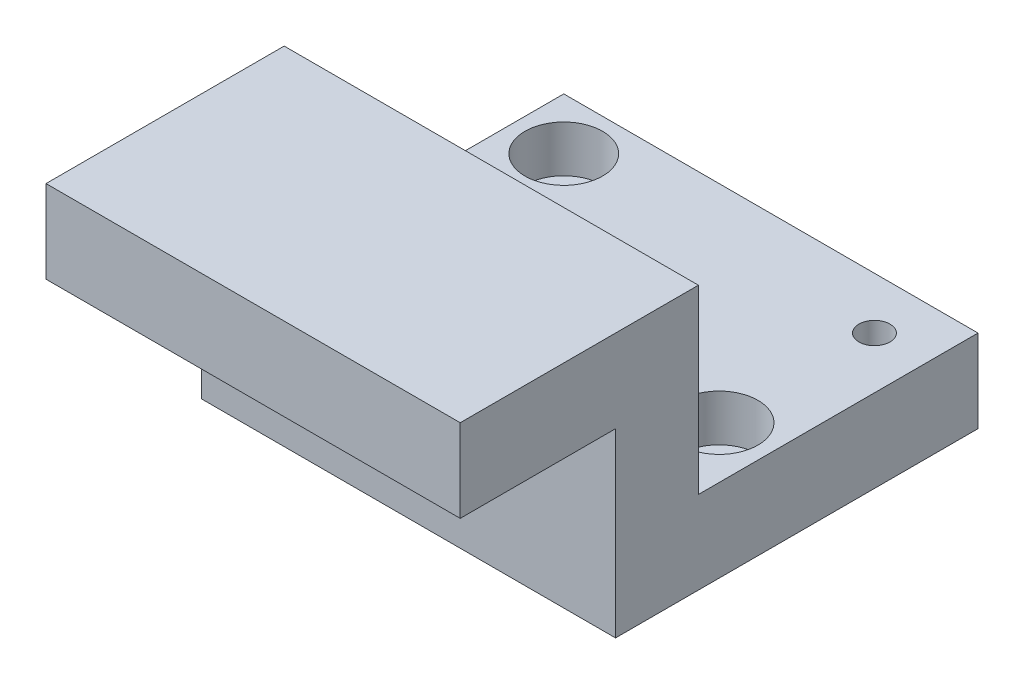
ISO-10303-21;
HEADER;
FILE_DESCRIPTION(('STEP AP214'),'2;1');
FILE_NAME('part.step','',(''),(''),'','','');
FILE_SCHEMA(('AUTOMOTIVE_DESIGN { 1 0 10303 214 1 1 1 1 }'));
ENDSEC;
DATA;
#1=APPLICATION_CONTEXT('core data for automotive mechanical design processes');
#2=APPLICATION_PROTOCOL_DEFINITION('international standard','automotive_design',2000,#1);
#3=PRODUCT_CONTEXT('',#1,'mechanical');
#4=PRODUCT('Part','Part','',(#3));
#5=PRODUCT_RELATED_PRODUCT_CATEGORY('part','',(#4));
#6=PRODUCT_DEFINITION_FORMATION('','',#4);
#7=PRODUCT_DEFINITION_CONTEXT('part definition',#1,'design');
#8=PRODUCT_DEFINITION('design','',#6,#7);
#9=PRODUCT_DEFINITION_SHAPE('','',#8);
#10=(LENGTH_UNIT() NAMED_UNIT(*) SI_UNIT(.MILLI.,.METRE.));
#11=(NAMED_UNIT(*) PLANE_ANGLE_UNIT() SI_UNIT($,.RADIAN.));
#12=(NAMED_UNIT(*) SI_UNIT($,.STERADIAN.) SOLID_ANGLE_UNIT());
#13=UNCERTAINTY_MEASURE_WITH_UNIT(LENGTH_MEASURE(1.E-05),#10,'distance_accuracy_value','');
#14=(GEOMETRIC_REPRESENTATION_CONTEXT(3) GLOBAL_UNCERTAINTY_ASSIGNED_CONTEXT((#13)) GLOBAL_UNIT_ASSIGNED_CONTEXT((#10,
#11,#12)) REPRESENTATION_CONTEXT('',''));
#15=CARTESIAN_POINT('',(0.,0.,0.));
#16=DIRECTION('',(0.,0.,1.));
#17=DIRECTION('',(1.,0.,0.));
#18=AXIS2_PLACEMENT_3D('',#15,#16,#17);
#19=CARTESIAN_POINT('',(-40.,-25.5,100.));
#20=DIRECTION('',(1.,0.,0.));
#21=DIRECTION('',(0.,0.,-1.));
#22=AXIS2_PLACEMENT_3D('',#19,#20,#21);
#23=PLANE('',#22);
#24=DIRECTION('',(0.,-1.,0.));
#25=VECTOR('',#24,1.);
#26=CARTESIAN_POINT('',(-40.,25.5,54.));
#27=LINE('',#26,#25);
#28=CARTESIAN_POINT('',(-40.,25.5,54.));
#29=VERTEX_POINT('',#28);
#30=CARTESIAN_POINT('',(-40.,-9.5,54.));
#31=VERTEX_POINT('',#30);
#32=EDGE_CURVE('E98',#29,#31,#27,.T.);
#33=ORIENTED_EDGE('',*,*,#32,.T.);
#34=DIRECTION('',(0.,0.,-1.));
#35=VECTOR('',#34,1.);
#36=CARTESIAN_POINT('',(-40.,-9.49999999999999,0.));
#37=LINE('',#36,#35);
#38=CARTESIAN_POINT('',(-40.,-9.49999999999999,0.));
#39=VERTEX_POINT('',#38);
#40=EDGE_CURVE('E109',#31,#39,#37,.T.);
#41=ORIENTED_EDGE('',*,*,#40,.T.);
#42=DIRECTION('',(0.,-1.,0.));
#43=VECTOR('',#42,1.);
#44=CARTESIAN_POINT('',(-40.,-25.5,0.));
#45=LINE('',#44,#43);
#46=CARTESIAN_POINT('',(-40.,-25.5,0.));
#47=VERTEX_POINT('',#46);
#48=EDGE_CURVE('E149',#39,#47,#45,.T.);
#49=ORIENTED_EDGE('',*,*,#48,.T.);
#50=DIRECTION('',(0.,0.,-1.));
#51=VECTOR('',#50,1.);
#52=CARTESIAN_POINT('',(-40.,-25.5,100.));
#53=LINE('',#52,#51);
#54=CARTESIAN_POINT('',(-40.,-25.5,70.));
#55=VERTEX_POINT('',#54);
#56=EDGE_CURVE('E11',#55,#47,#53,.T.);
#57=ORIENTED_EDGE('',*,*,#56,.F.);
#58=DIRECTION('',(0.,1.,0.));
#59=VECTOR('',#58,1.);
#60=CARTESIAN_POINT('',(-40.,-25.5,70.));
#61=LINE('',#60,#59);
#62=CARTESIAN_POINT('',(-40.,9.50000000000001,70.));
#63=VERTEX_POINT('',#62);
#64=EDGE_CURVE('E165',#55,#63,#61,.T.);
#65=ORIENTED_EDGE('',*,*,#64,.T.);
#66=DIRECTION('',(0.,0.,1.));
#67=VECTOR('',#66,1.);
#68=CARTESIAN_POINT('',(-40.,9.50000000000001,100.));
#69=LINE('',#68,#67);
#70=CARTESIAN_POINT('',(-40.,9.50000000000001,100.));
#71=VERTEX_POINT('',#70);
#72=EDGE_CURVE('E167',#63,#71,#69,.T.);
#73=ORIENTED_EDGE('',*,*,#72,.T.);
#74=DIRECTION('',(0.,-1.,0.));
#75=VECTOR('',#74,1.);
#76=CARTESIAN_POINT('',(-40.,-25.5,100.));
#77=LINE('',#76,#75);
#78=CARTESIAN_POINT('',(-40.,25.5,100.));
#79=VERTEX_POINT('',#78);
#80=EDGE_CURVE('E123',#79,#71,#77,.T.);
#81=ORIENTED_EDGE('',*,*,#80,.F.);
#82=DIRECTION('',(0.,0.,-1.));
#83=VECTOR('',#82,1.);
#84=CARTESIAN_POINT('',(-40.,25.5,100.));
#85=LINE('',#84,#83);
#86=EDGE_CURVE('E116',#79,#29,#85,.T.);
#87=ORIENTED_EDGE('',*,*,#86,.T.);
#88=EDGE_LOOP('',(#33,#41,#49,#57,#65,#73,#81,#87));
#89=FACE_BOUND('',#88,.T.);
#90=ADVANCED_FACE('F35',(#89),#23,.F.);
#91=CARTESIAN_POINT('',(40.,-25.5,100.));
#92=DIRECTION('',(0.,1.,0.));
#93=DIRECTION('',(-1.,0.,0.));
#94=AXIS2_PLACEMENT_3D('',#91,#92,#93);
#95=PLANE('',#94);
#96=CARTESIAN_POINT('',(-30.,-25.5,40.));
#97=DIRECTION('',(0.,1.,0.));
#98=DIRECTION('',(0.,0.,1.));
#99=AXIS2_PLACEMENT_3D('',#96,#97,#98);
#100=CIRCLE('',#99,3.);
#101=CARTESIAN_POINT('',(-30.,-25.5,43.));
#102=VERTEX_POINT('',#101);
#103=EDGE_CURVE('E207',#102,#102,#100,.T.);
#104=ORIENTED_EDGE('',*,*,#103,.T.);
#105=EDGE_LOOP('',(#104));
#106=FACE_BOUND('',#105,.T.);
#107=CARTESIAN_POINT('',(30.,-25.5,9.99999999999999));
#108=DIRECTION('',(0.,1.,0.));
#109=DIRECTION('',(0.,0.,1.));
#110=AXIS2_PLACEMENT_3D('',#107,#108,#109);
#111=CIRCLE('',#110,3.);
#112=CARTESIAN_POINT('',(30.,-25.5,13.));
#113=VERTEX_POINT('',#112);
#114=EDGE_CURVE('E201',#113,#113,#111,.T.);
#115=ORIENTED_EDGE('',*,*,#114,.T.);
#116=EDGE_LOOP('',(#115));
#117=FACE_BOUND('',#116,.T.);
#118=CARTESIAN_POINT('',(-30.,-25.5,9.99999999999999));
#119=DIRECTION('',(0.,1.,0.));
#120=DIRECTION('',(0.,0.,1.));
#121=AXIS2_PLACEMENT_3D('',#118,#119,#120);
#122=CIRCLE('',#121,4.5);
#123=CARTESIAN_POINT('',(-30.,-25.5,14.5));
#124=VERTEX_POINT('',#123);
#125=EDGE_CURVE('E189',#124,#124,#122,.T.);
#126=ORIENTED_EDGE('',*,*,#125,.T.);
#127=EDGE_LOOP('',(#126));
#128=FACE_BOUND('',#127,.T.);
#129=CARTESIAN_POINT('',(30.,-25.5,40.));
#130=DIRECTION('',(0.,1.,0.));
#131=DIRECTION('',(0.,0.,1.));
#132=AXIS2_PLACEMENT_3D('',#129,#130,#131);
#133=CIRCLE('',#132,4.5);
#134=CARTESIAN_POINT('',(30.,-25.5,44.5));
#135=VERTEX_POINT('',#134);
#136=EDGE_CURVE('E176',#135,#135,#133,.T.);
#137=ORIENTED_EDGE('',*,*,#136,.T.);
#138=EDGE_LOOP('',(#137));
#139=FACE_BOUND('',#138,.T.);
#140=DIRECTION('',(0.,0.,-1.));
#141=VECTOR('',#140,1.);
#142=CARTESIAN_POINT('',(40.,-25.5,100.));
#143=LINE('',#142,#141);
#144=CARTESIAN_POINT('',(40.,-25.5,70.));
#145=VERTEX_POINT('',#144);
#146=CARTESIAN_POINT('',(40.,-25.5,0.));
#147=VERTEX_POINT('',#146);
#148=EDGE_CURVE('E42',#145,#147,#143,.T.);
#149=ORIENTED_EDGE('',*,*,#148,.F.);
#150=DIRECTION('',(1.,0.,0.));
#151=VECTOR('',#150,1.);
#152=CARTESIAN_POINT('',(-40.,-25.5,70.));
#153=LINE('',#152,#151);
#154=EDGE_CURVE('E156',#55,#145,#153,.T.);
#155=ORIENTED_EDGE('',*,*,#154,.F.);
#156=ORIENTED_EDGE('',*,*,#56,.T.);
#157=DIRECTION('',(1.,0.,0.));
#158=VECTOR('',#157,1.);
#159=CARTESIAN_POINT('',(40.,-25.5,0.));
#160=LINE('',#159,#158);
#161=EDGE_CURVE('E144',#47,#147,#160,.T.);
#162=ORIENTED_EDGE('',*,*,#161,.T.);
#163=EDGE_LOOP('',(#149,#155,#156,#162));
#164=FACE_BOUND('',#163,.T.);
#165=ADVANCED_FACE('F145',(#106,#117,#128,#139,#164),#95,.F.);
#166=CARTESIAN_POINT('',(40.,-25.5,100.));
#167=DIRECTION('',(-1.,0.,0.));
#168=DIRECTION('',(0.,0.,1.));
#169=AXIS2_PLACEMENT_3D('',#166,#167,#168);
#170=PLANE('',#169);
#171=DIRECTION('',(0.,1.,0.));
#172=VECTOR('',#171,1.);
#173=CARTESIAN_POINT('',(40.,-25.5,0.));
#174=LINE('',#173,#172);
#175=CARTESIAN_POINT('',(40.,-9.5,0.));
#176=VERTEX_POINT('',#175);
#177=EDGE_CURVE('E130',#147,#176,#174,.T.);
#178=ORIENTED_EDGE('',*,*,#177,.T.);
#179=DIRECTION('',(0.,0.,-1.));
#180=VECTOR('',#179,1.);
#181=CARTESIAN_POINT('',(40.,-9.49999999999999,0.));
#182=LINE('',#181,#180);
#183=CARTESIAN_POINT('',(40.,-9.5,54.));
#184=VERTEX_POINT('',#183);
#185=EDGE_CURVE('E49',#184,#176,#182,.T.);
#186=ORIENTED_EDGE('',*,*,#185,.F.);
#187=DIRECTION('',(0.,-1.,0.));
#188=VECTOR('',#187,1.);
#189=CARTESIAN_POINT('',(40.,25.5,54.));
#190=LINE('',#189,#188);
#191=CARTESIAN_POINT('',(40.,25.5,54.));
#192=VERTEX_POINT('',#191);
#193=EDGE_CURVE('E174',#192,#184,#190,.T.);
#194=ORIENTED_EDGE('',*,*,#193,.F.);
#195=DIRECTION('',(0.,0.,-1.));
#196=VECTOR('',#195,1.);
#197=CARTESIAN_POINT('',(40.,25.5,100.));
#198=LINE('',#197,#196);
#199=CARTESIAN_POINT('',(40.,25.5,100.));
#200=VERTEX_POINT('',#199);
#201=EDGE_CURVE('E119',#200,#192,#198,.T.);
#202=ORIENTED_EDGE('',*,*,#201,.F.);
#203=DIRECTION('',(0.,1.,0.));
#204=VECTOR('',#203,1.);
#205=CARTESIAN_POINT('',(40.,-25.5,100.));
#206=LINE('',#205,#204);
#207=CARTESIAN_POINT('',(40.,9.50000000000001,100.));
#208=VERTEX_POINT('',#207);
#209=EDGE_CURVE('E127',#208,#200,#206,.T.);
#210=ORIENTED_EDGE('',*,*,#209,.F.);
#211=DIRECTION('',(0.,0.,1.));
#212=VECTOR('',#211,1.);
#213=CARTESIAN_POINT('',(40.,9.50000000000001,100.));
#214=LINE('',#213,#212);
#215=CARTESIAN_POINT('',(40.,9.50000000000001,70.));
#216=VERTEX_POINT('',#215);
#217=EDGE_CURVE('E57',#216,#208,#214,.T.);
#218=ORIENTED_EDGE('',*,*,#217,.F.);
#219=DIRECTION('',(0.,1.,0.));
#220=VECTOR('',#219,1.);
#221=CARTESIAN_POINT('',(40.,-25.5,70.));
#222=LINE('',#221,#220);
#223=EDGE_CURVE('E140',#145,#216,#222,.T.);
#224=ORIENTED_EDGE('',*,*,#223,.F.);
#225=ORIENTED_EDGE('',*,*,#148,.T.);
#226=EDGE_LOOP('',(#178,#186,#194,#202,#210,#218,#224,#225));
#227=FACE_BOUND('',#226,.T.);
#228=ADVANCED_FACE('F137',(#227),#170,.F.);
#229=CARTESIAN_POINT('',(40.,25.5,100.));
#230=DIRECTION('',(0.,-1.,0.));
#231=DIRECTION('',(1.,0.,0.));
#232=AXIS2_PLACEMENT_3D('',#229,#230,#231);
#233=PLANE('',#232);
#234=ORIENTED_EDGE('',*,*,#201,.T.);
#235=DIRECTION('',(1.,0.,0.));
#236=VECTOR('',#235,1.);
#237=CARTESIAN_POINT('',(-40.,25.5,54.));
#238=LINE('',#237,#236);
#239=EDGE_CURVE('E102',#29,#192,#238,.T.);
#240=ORIENTED_EDGE('',*,*,#239,.F.);
#241=ORIENTED_EDGE('',*,*,#86,.F.);
#242=DIRECTION('',(-1.,0.,0.));
#243=VECTOR('',#242,1.);
#244=CARTESIAN_POINT('',(40.,25.5,100.));
#245=LINE('',#244,#243);
#246=EDGE_CURVE('E124',#200,#79,#245,.T.);
#247=ORIENTED_EDGE('',*,*,#246,.F.);
#248=EDGE_LOOP('',(#234,#240,#241,#247));
#249=FACE_BOUND('',#248,.T.);
#250=ADVANCED_FACE('F114',(#249),#233,.F.);
#251=CARTESIAN_POINT('',(0.,0.,100.));
#252=DIRECTION('',(0.,0.,1.));
#253=DIRECTION('',(1.,0.,0.));
#254=AXIS2_PLACEMENT_3D('',#251,#252,#253);
#255=PLANE('',#254);
#256=DIRECTION('',(1.,0.,0.));
#257=VECTOR('',#256,1.);
#258=CARTESIAN_POINT('',(-40.,9.50000000000001,100.));
#259=LINE('',#258,#257);
#260=EDGE_CURVE('E159',#71,#208,#259,.T.);
#261=ORIENTED_EDGE('',*,*,#260,.T.);
#262=ORIENTED_EDGE('',*,*,#209,.T.);
#263=ORIENTED_EDGE('',*,*,#246,.T.);
#264=ORIENTED_EDGE('',*,*,#80,.T.);
#265=EDGE_LOOP('',(#261,#262,#263,#264));
#266=FACE_BOUND('',#265,.T.);
#267=ADVANCED_FACE('F257',(#266),#255,.T.);
#268=CARTESIAN_POINT('',(0.,0.,0.));
#269=DIRECTION('',(0.,0.,1.));
#270=DIRECTION('',(1.,0.,0.));
#271=AXIS2_PLACEMENT_3D('',#268,#269,#270);
#272=PLANE('',#271);
#273=ORIENTED_EDGE('',*,*,#48,.F.);
#274=DIRECTION('',(1.,0.,0.));
#275=VECTOR('',#274,1.);
#276=CARTESIAN_POINT('',(-40.,-9.49999999999999,0.));
#277=LINE('',#276,#275);
#278=EDGE_CURVE('E151',#39,#176,#277,.T.);
#279=ORIENTED_EDGE('',*,*,#278,.T.);
#280=ORIENTED_EDGE('',*,*,#177,.F.);
#281=ORIENTED_EDGE('',*,*,#161,.F.);
#282=EDGE_LOOP('',(#273,#279,#280,#281));
#283=FACE_BOUND('',#282,.T.);
#284=ADVANCED_FACE('F150',(#283),#272,.F.);
#285=CARTESIAN_POINT('',(-40.,9.50000000000001,100.));
#286=DIRECTION('',(0.,1.,0.));
#287=DIRECTION('',(0.,0.,1.));
#288=AXIS2_PLACEMENT_3D('',#285,#286,#287);
#289=PLANE('',#288);
#290=ORIENTED_EDGE('',*,*,#217,.T.);
#291=ORIENTED_EDGE('',*,*,#260,.F.);
#292=ORIENTED_EDGE('',*,*,#72,.F.);
#293=DIRECTION('',(1.,0.,0.));
#294=VECTOR('',#293,1.);
#295=CARTESIAN_POINT('',(-40.,9.50000000000001,70.));
#296=LINE('',#295,#294);
#297=EDGE_CURVE('E160',#63,#216,#296,.T.);
#298=ORIENTED_EDGE('',*,*,#297,.T.);
#299=EDGE_LOOP('',(#290,#291,#292,#298));
#300=FACE_BOUND('',#299,.T.);
#301=ADVANCED_FACE('F260',(#300),#289,.F.);
#302=CARTESIAN_POINT('',(-40.,-25.5,70.));
#303=DIRECTION('',(0.,0.,-1.));
#304=DIRECTION('',(-1.,0.,0.));
#305=AXIS2_PLACEMENT_3D('',#302,#303,#304);
#306=PLANE('',#305);
#307=ORIENTED_EDGE('',*,*,#223,.T.);
#308=ORIENTED_EDGE('',*,*,#297,.F.);
#309=ORIENTED_EDGE('',*,*,#64,.F.);
#310=ORIENTED_EDGE('',*,*,#154,.T.);
#311=EDGE_LOOP('',(#307,#308,#309,#310));
#312=FACE_BOUND('',#311,.T.);
#313=ADVANCED_FACE('F219',(#312),#306,.F.);
#314=CARTESIAN_POINT('',(-40.,-9.49999999999999,0.));
#315=DIRECTION('',(0.,-1.,0.));
#316=DIRECTION('',(0.,0.,-1.));
#317=AXIS2_PLACEMENT_3D('',#314,#315,#316);
#318=PLANE('',#317);
#319=CARTESIAN_POINT('',(-30.,-9.5,40.));
#320=DIRECTION('',(0.,1.,0.));
#321=DIRECTION('',(0.,0.,1.));
#322=AXIS2_PLACEMENT_3D('',#319,#320,#321);
#323=CIRCLE('',#322,3.);
#324=CARTESIAN_POINT('',(-30.,-9.5,43.));
#325=VERTEX_POINT('',#324);
#326=EDGE_CURVE('E210',#325,#325,#323,.T.);
#327=ORIENTED_EDGE('',*,*,#326,.F.);
#328=EDGE_LOOP('',(#327));
#329=FACE_BOUND('',#328,.T.);
#330=CARTESIAN_POINT('',(30.,-9.49999999999999,9.99999999999999));
#331=DIRECTION('',(0.,1.,0.));
#332=DIRECTION('',(0.,0.,1.));
#333=AXIS2_PLACEMENT_3D('',#330,#331,#332);
#334=CIRCLE('',#333,3.);
#335=CARTESIAN_POINT('',(30.,-9.49999999999999,13.));
#336=VERTEX_POINT('',#335);
#337=EDGE_CURVE('E204',#336,#336,#334,.T.);
#338=ORIENTED_EDGE('',*,*,#337,.F.);
#339=EDGE_LOOP('',(#338));
#340=FACE_BOUND('',#339,.T.);
#341=CARTESIAN_POINT('',(-30.,-9.49999999999999,9.99999999999999));
#342=DIRECTION('',(0.,1.,0.));
#343=DIRECTION('',(0.,0.,1.));
#344=AXIS2_PLACEMENT_3D('',#341,#342,#343);
#345=CIRCLE('',#344,7.5);
#346=CARTESIAN_POINT('',(-30.,-9.49999999999999,17.5));
#347=VERTEX_POINT('',#346);
#348=EDGE_CURVE('E198',#347,#347,#345,.T.);
#349=ORIENTED_EDGE('',*,*,#348,.F.);
#350=EDGE_LOOP('',(#349));
#351=FACE_BOUND('',#350,.T.);
#352=CARTESIAN_POINT('',(30.,-9.5,40.));
#353=DIRECTION('',(0.,1.,0.));
#354=DIRECTION('',(0.,0.,1.));
#355=AXIS2_PLACEMENT_3D('',#352,#353,#354);
#356=CIRCLE('',#355,7.5);
#357=CARTESIAN_POINT('',(30.,-9.5,47.5));
#358=VERTEX_POINT('',#357);
#359=EDGE_CURVE('E186',#358,#358,#356,.T.);
#360=ORIENTED_EDGE('',*,*,#359,.F.);
#361=EDGE_LOOP('',(#360));
#362=FACE_BOUND('',#361,.T.);
#363=ORIENTED_EDGE('',*,*,#185,.T.);
#364=ORIENTED_EDGE('',*,*,#278,.F.);
#365=ORIENTED_EDGE('',*,*,#40,.F.);
#366=DIRECTION('',(1.,0.,0.));
#367=VECTOR('',#366,1.);
#368=CARTESIAN_POINT('',(-40.,-9.5,54.));
#369=LINE('',#368,#367);
#370=EDGE_CURVE('E104',#31,#184,#369,.T.);
#371=ORIENTED_EDGE('',*,*,#370,.T.);
#372=EDGE_LOOP('',(#363,#364,#365,#371));
#373=FACE_BOUND('',#372,.T.);
#374=ADVANCED_FACE('F216',(#329,#340,#351,#362,#373),#318,.F.);
#375=CARTESIAN_POINT('',(-40.,25.5,54.));
#376=DIRECTION('',(0.,0.,1.));
#377=DIRECTION('',(0.,-1.,0.));
#378=AXIS2_PLACEMENT_3D('',#375,#376,#377);
#379=PLANE('',#378);
#380=ORIENTED_EDGE('',*,*,#193,.T.);
#381=ORIENTED_EDGE('',*,*,#370,.F.);
#382=ORIENTED_EDGE('',*,*,#32,.F.);
#383=ORIENTED_EDGE('',*,*,#239,.T.);
#384=EDGE_LOOP('',(#380,#381,#382,#383));
#385=FACE_BOUND('',#384,.T.);
#386=ADVANCED_FACE('F101',(#385),#379,.F.);
#387=CARTESIAN_POINT('',(30.,-9.5,40.));
#388=DIRECTION('',(0.,1.,0.));
#389=DIRECTION('',(0.,0.,1.));
#390=AXIS2_PLACEMENT_3D('',#387,#388,#389);
#391=CYLINDRICAL_SURFACE('',#390,4.5);
#392=ORIENTED_EDGE('',*,*,#136,.F.);
#393=EDGE_LOOP('',(#392));
#394=FACE_BOUND('',#393,.T.);
#395=CARTESIAN_POINT('',(30.,-18.5,40.));
#396=DIRECTION('',(0.,1.,0.));
#397=DIRECTION('',(0.,0.,1.));
#398=AXIS2_PLACEMENT_3D('',#395,#396,#397);
#399=CIRCLE('',#398,4.5);
#400=CARTESIAN_POINT('',(30.,-18.5,44.5));
#401=VERTEX_POINT('',#400);
#402=EDGE_CURVE('E180',#401,#401,#399,.T.);
#403=ORIENTED_EDGE('',*,*,#402,.T.);
#404=EDGE_LOOP('',(#403));
#405=FACE_BOUND('',#404,.T.);
#406=ADVANCED_FACE('F240',(#394,#405),#391,.F.);
#407=CARTESIAN_POINT('',(34.5,-18.5,40.));
#408=DIRECTION('',(0.,-1.,0.));
#409=DIRECTION('',(0.,0.,-1.));
#410=AXIS2_PLACEMENT_3D('',#407,#408,#409);
#411=PLANE('',#410);
#412=ORIENTED_EDGE('',*,*,#402,.F.);
#413=EDGE_LOOP('',(#412));
#414=FACE_BOUND('',#413,.T.);
#415=CARTESIAN_POINT('',(30.,-18.5,40.));
#416=DIRECTION('',(0.,1.,0.));
#417=DIRECTION('',(0.,0.,1.));
#418=AXIS2_PLACEMENT_3D('',#415,#416,#417);
#419=CIRCLE('',#418,7.5);
#420=CARTESIAN_POINT('',(30.,-18.5,47.5));
#421=VERTEX_POINT('',#420);
#422=EDGE_CURVE('E183',#421,#421,#419,.T.);
#423=ORIENTED_EDGE('',*,*,#422,.T.);
#424=EDGE_LOOP('',(#423));
#425=FACE_BOUND('',#424,.T.);
#426=ADVANCED_FACE('F230',(#414,#425),#411,.F.);
#427=CARTESIAN_POINT('',(30.,-9.5,40.));
#428=DIRECTION('',(0.,1.,0.));
#429=DIRECTION('',(0.,0.,1.));
#430=AXIS2_PLACEMENT_3D('',#427,#428,#429);
#431=CYLINDRICAL_SURFACE('',#430,7.5);
#432=ORIENTED_EDGE('',*,*,#422,.F.);
#433=EDGE_LOOP('',(#432));
#434=FACE_BOUND('',#433,.T.);
#435=ORIENTED_EDGE('',*,*,#359,.T.);
#436=EDGE_LOOP('',(#435));
#437=FACE_BOUND('',#436,.T.);
#438=ADVANCED_FACE('F227',(#434,#437),#431,.F.);
#439=CARTESIAN_POINT('',(-30.,-9.49999999999999,9.99999999999999));
#440=DIRECTION('',(0.,1.,0.));
#441=DIRECTION('',(0.,0.,1.));
#442=AXIS2_PLACEMENT_3D('',#439,#440,#441);
#443=CYLINDRICAL_SURFACE('',#442,4.5);
#444=ORIENTED_EDGE('',*,*,#125,.F.);
#445=EDGE_LOOP('',(#444));
#446=FACE_BOUND('',#445,.T.);
#447=CARTESIAN_POINT('',(-30.,-18.5,9.99999999999999));
#448=DIRECTION('',(0.,1.,0.));
#449=DIRECTION('',(0.,0.,1.));
#450=AXIS2_PLACEMENT_3D('',#447,#448,#449);
#451=CIRCLE('',#450,4.5);
#452=CARTESIAN_POINT('',(-30.,-18.5,14.5));
#453=VERTEX_POINT('',#452);
#454=EDGE_CURVE('E192',#453,#453,#451,.T.);
#455=ORIENTED_EDGE('',*,*,#454,.T.);
#456=EDGE_LOOP('',(#455));
#457=FACE_BOUND('',#456,.T.);
#458=ADVANCED_FACE('F229',(#446,#457),#443,.F.);
#459=CARTESIAN_POINT('',(-25.5,-18.5,9.99999999999999));
#460=DIRECTION('',(0.,-1.,0.));
#461=DIRECTION('',(0.,0.,-1.));
#462=AXIS2_PLACEMENT_3D('',#459,#460,#461);
#463=PLANE('',#462);
#464=ORIENTED_EDGE('',*,*,#454,.F.);
#465=EDGE_LOOP('',(#464));
#466=FACE_BOUND('',#465,.T.);
#467=CARTESIAN_POINT('',(-30.,-18.5,9.99999999999999));
#468=DIRECTION('',(0.,1.,0.));
#469=DIRECTION('',(0.,0.,1.));
#470=AXIS2_PLACEMENT_3D('',#467,#468,#469);
#471=CIRCLE('',#470,7.5);
#472=CARTESIAN_POINT('',(-30.,-18.5,17.5));
#473=VERTEX_POINT('',#472);
#474=EDGE_CURVE('E195',#473,#473,#471,.T.);
#475=ORIENTED_EDGE('',*,*,#474,.T.);
#476=EDGE_LOOP('',(#475));
#477=FACE_BOUND('',#476,.T.);
#478=ADVANCED_FACE('F237',(#466,#477),#463,.F.);
#479=CARTESIAN_POINT('',(-30.,-9.49999999999999,9.99999999999999));
#480=DIRECTION('',(0.,1.,0.));
#481=DIRECTION('',(0.,0.,1.));
#482=AXIS2_PLACEMENT_3D('',#479,#480,#481);
#483=CYLINDRICAL_SURFACE('',#482,7.5);
#484=ORIENTED_EDGE('',*,*,#474,.F.);
#485=EDGE_LOOP('',(#484));
#486=FACE_BOUND('',#485,.T.);
#487=ORIENTED_EDGE('',*,*,#348,.T.);
#488=EDGE_LOOP('',(#487));
#489=FACE_BOUND('',#488,.T.);
#490=ADVANCED_FACE('F304',(#486,#489),#483,.F.);
#491=CARTESIAN_POINT('',(30.,-9.49999999999999,9.99999999999999));
#492=DIRECTION('',(0.,1.,0.));
#493=DIRECTION('',(0.,0.,1.));
#494=AXIS2_PLACEMENT_3D('',#491,#492,#493);
#495=CYLINDRICAL_SURFACE('',#494,3.);
#496=ORIENTED_EDGE('',*,*,#114,.F.);
#497=EDGE_LOOP('',(#496));
#498=FACE_BOUND('',#497,.T.);
#499=ORIENTED_EDGE('',*,*,#337,.T.);
#500=EDGE_LOOP('',(#499));
#501=FACE_BOUND('',#500,.T.);
#502=ADVANCED_FACE('F313',(#498,#501),#495,.F.);
#503=CARTESIAN_POINT('',(-30.,-9.5,40.));
#504=DIRECTION('',(0.,1.,0.));
#505=DIRECTION('',(0.,0.,1.));
#506=AXIS2_PLACEMENT_3D('',#503,#504,#505);
#507=CYLINDRICAL_SURFACE('',#506,3.);
#508=ORIENTED_EDGE('',*,*,#103,.F.);
#509=EDGE_LOOP('',(#508));
#510=FACE_BOUND('',#509,.T.);
#511=ORIENTED_EDGE('',*,*,#326,.T.);
#512=EDGE_LOOP('',(#511));
#513=FACE_BOUND('',#512,.T.);
#514=ADVANCED_FACE('F214',(#510,#513),#507,.F.);
#515=CLOSED_SHELL('',(#90,#165,#228,#250,#267,#284,#301,#313,#374,#386,#406,#426,#438,#458,#478,
#490,#502,#514));
#516=MANIFOLD_SOLID_BREP('B2',#515);
#517=ADVANCED_BREP_SHAPE_REPRESENTATION('',(#18,#516),#14);
#518=SHAPE_DEFINITION_REPRESENTATION(#9,#517);
ENDSEC;
END-ISO-10303-21;
